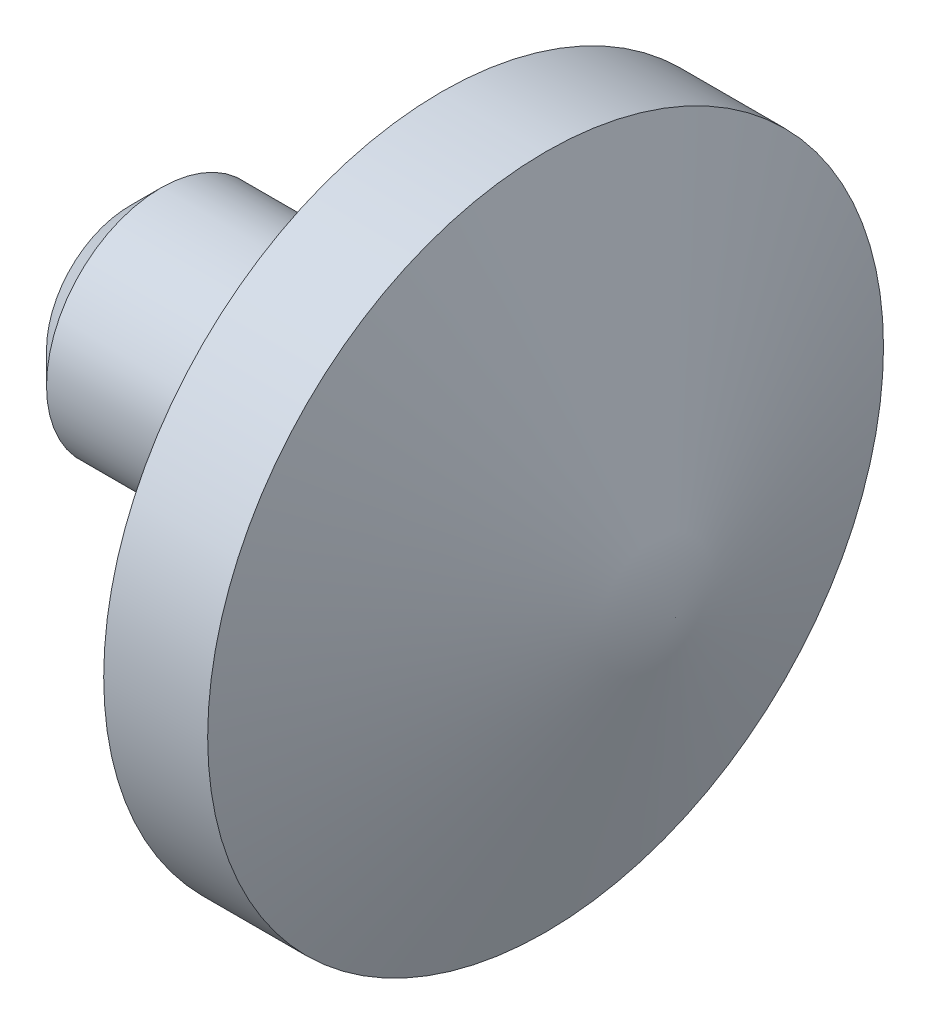
ISO-10303-21;
HEADER;
FILE_DESCRIPTION(('STEP AP214'),'2;1');
FILE_NAME('part.step','',(''),(''),'','','');
FILE_SCHEMA(('AUTOMOTIVE_DESIGN { 1 0 10303 214 1 1 1 1 }'));
ENDSEC;
DATA;
#1=APPLICATION_CONTEXT('core data for automotive mechanical design processes');
#2=APPLICATION_PROTOCOL_DEFINITION('international standard','automotive_design',2000,#1);
#3=PRODUCT_CONTEXT('',#1,'mechanical');
#4=PRODUCT('Part','Part','',(#3));
#5=PRODUCT_RELATED_PRODUCT_CATEGORY('part','',(#4));
#6=PRODUCT_DEFINITION_FORMATION('','',#4);
#7=PRODUCT_DEFINITION_CONTEXT('part definition',#1,'design');
#8=PRODUCT_DEFINITION('design','',#6,#7);
#9=PRODUCT_DEFINITION_SHAPE('','',#8);
#10=(LENGTH_UNIT() NAMED_UNIT(*) SI_UNIT(.MILLI.,.METRE.));
#11=(NAMED_UNIT(*) PLANE_ANGLE_UNIT() SI_UNIT($,.RADIAN.));
#12=(NAMED_UNIT(*) SI_UNIT($,.STERADIAN.) SOLID_ANGLE_UNIT());
#13=UNCERTAINTY_MEASURE_WITH_UNIT(LENGTH_MEASURE(1.E-05),#10,'distance_accuracy_value','');
#14=(GEOMETRIC_REPRESENTATION_CONTEXT(3) GLOBAL_UNCERTAINTY_ASSIGNED_CONTEXT((#13)) GLOBAL_UNIT_ASSIGNED_CONTEXT((#10,
#11,#12)) REPRESENTATION_CONTEXT('',''));
#15=CARTESIAN_POINT('',(0.,0.,0.));
#16=DIRECTION('',(0.,0.,1.));
#17=DIRECTION('',(1.,0.,0.));
#18=AXIS2_PLACEMENT_3D('',#15,#16,#17);
#19=CARTESIAN_POINT('',(2.25,0.,0.));
#20=DIRECTION('',(-1.,0.,0.));
#21=DIRECTION('',(0.,0.,1.));
#22=AXIS2_PLACEMENT_3D('',#19,#20,#21);
#23=CONICAL_SURFACE('',#22,0.,1.20362249297668);
#24=CARTESIAN_POINT('',(1.,0.,0.));
#25=DIRECTION('',(1.,0.,0.));
#26=DIRECTION('',(0.,0.,-1.));
#27=AXIS2_PLACEMENT_3D('',#24,#25,#26);
#28=CIRCLE('',#27,3.25);
#29=CARTESIAN_POINT('',(1.,0.,-3.25));
#30=VERTEX_POINT('',#29);
#31=EDGE_CURVE('E98',#30,#30,#28,.T.);
#32=ORIENTED_EDGE('',*,*,#31,.T.);
#33=EDGE_LOOP('',(#32));
#34=FACE_BOUND('',#33,.T.);
#35=CARTESIAN_POINT('',(2.25,0.,0.));
#36=VERTEX_POINT('',#35);
#37=VERTEX_LOOP('',#36);
#38=FACE_BOUND('',#37,.T.);
#39=ADVANCED_FACE('F55',(#34,#38),#23,.T.);
#40=CARTESIAN_POINT('',(-3.,0.,0.));
#41=DIRECTION('',(-1.,0.,0.));
#42=DIRECTION('',(0.,0.,1.));
#43=AXIS2_PLACEMENT_3D('',#40,#41,#42);
#44=PLANE('',#43);
#45=CARTESIAN_POINT('',(-3.,0.,0.));
#46=DIRECTION('',(-1.,0.,0.));
#47=DIRECTION('',(0.,0.,1.));
#48=AXIS2_PLACEMENT_3D('',#45,#46,#47);
#49=CIRCLE('',#48,0.799999999999999);
#50=CARTESIAN_POINT('',(-3.,0.,0.799999999999999));
#51=VERTEX_POINT('',#50);
#52=EDGE_CURVE('E11',#51,#51,#49,.T.);
#53=ORIENTED_EDGE('',*,*,#52,.T.);
#54=EDGE_LOOP('',(#53));
#55=FACE_BOUND('',#54,.T.);
#56=ADVANCED_FACE('F68',(#55),#44,.T.);
#57=CARTESIAN_POINT('',(0.,0.,0.));
#58=DIRECTION('',(1.,0.,0.));
#59=DIRECTION('',(0.,0.,-1.));
#60=AXIS2_PLACEMENT_3D('',#57,#58,#59);
#61=CYLINDRICAL_SURFACE('',#60,1.1);
#62=CARTESIAN_POINT('',(-2.7,0.,0.));
#63=DIRECTION('',(-1.,0.,0.));
#64=DIRECTION('',(0.,0.,1.));
#65=AXIS2_PLACEMENT_3D('',#62,#63,#64);
#66=CIRCLE('',#65,1.1);
#67=CARTESIAN_POINT('',(-2.7,0.,1.1));
#68=VERTEX_POINT('',#67);
#69=EDGE_CURVE('E64',#68,#68,#66,.F.);
#70=ORIENTED_EDGE('',*,*,#69,.T.);
#71=EDGE_LOOP('',(#70));
#72=FACE_BOUND('',#71,.T.);
#73=CARTESIAN_POINT('',(0.,0.,0.));
#74=DIRECTION('',(1.,0.,0.));
#75=DIRECTION('',(0.,0.,-1.));
#76=AXIS2_PLACEMENT_3D('',#73,#74,#75);
#77=CIRCLE('',#76,1.1);
#78=CARTESIAN_POINT('',(0.,0.,-1.1));
#79=VERTEX_POINT('',#78);
#80=EDGE_CURVE('E102',#79,#79,#77,.T.);
#81=ORIENTED_EDGE('',*,*,#80,.F.);
#82=EDGE_LOOP('',(#81));
#83=FACE_BOUND('',#82,.T.);
#84=ADVANCED_FACE('F74',(#72,#83),#61,.T.);
#85=CARTESIAN_POINT('',(0.,3.25,0.));
#86=DIRECTION('',(-1.,0.,0.));
#87=DIRECTION('',(0.,0.,1.));
#88=AXIS2_PLACEMENT_3D('',#85,#86,#87);
#89=PLANE('',#88);
#90=ORIENTED_EDGE('',*,*,#80,.T.);
#91=EDGE_LOOP('',(#90));
#92=FACE_BOUND('',#91,.T.);
#93=CARTESIAN_POINT('',(0.,0.,0.));
#94=DIRECTION('',(1.,0.,0.));
#95=DIRECTION('',(0.,0.,-1.));
#96=AXIS2_PLACEMENT_3D('',#93,#94,#95);
#97=CIRCLE('',#96,3.25);
#98=CARTESIAN_POINT('',(0.,0.,-3.25));
#99=VERTEX_POINT('',#98);
#100=EDGE_CURVE('E96',#99,#99,#97,.T.);
#101=ORIENTED_EDGE('',*,*,#100,.F.);
#102=EDGE_LOOP('',(#101));
#103=FACE_BOUND('',#102,.T.);
#104=ADVANCED_FACE('F81',(#92,#103),#89,.T.);
#105=CARTESIAN_POINT('',(0.,0.,0.));
#106=DIRECTION('',(1.,0.,0.));
#107=DIRECTION('',(0.,0.,-1.));
#108=AXIS2_PLACEMENT_3D('',#105,#106,#107);
#109=CYLINDRICAL_SURFACE('',#108,3.25);
#110=ORIENTED_EDGE('',*,*,#100,.T.);
#111=EDGE_LOOP('',(#110));
#112=FACE_BOUND('',#111,.T.);
#113=ORIENTED_EDGE('',*,*,#31,.F.);
#114=EDGE_LOOP('',(#113));
#115=FACE_BOUND('',#114,.T.);
#116=ADVANCED_FACE('F84',(#112,#115),#109,.T.);
#117=CARTESIAN_POINT('',(-2.7,0.,0.));
#118=DIRECTION('',(1.,0.,0.));
#119=DIRECTION('',(0.,0.,-1.));
#120=AXIS2_PLACEMENT_3D('',#117,#118,#119);
#121=CONICAL_SURFACE('',#120,1.1,0.785398163397449);
#122=ORIENTED_EDGE('',*,*,#52,.F.);
#123=EDGE_LOOP('',(#122));
#124=FACE_BOUND('',#123,.T.);
#125=ORIENTED_EDGE('',*,*,#69,.F.);
#126=EDGE_LOOP('',(#125));
#127=FACE_BOUND('',#126,.T.);
#128=ADVANCED_FACE('F58',(#124,#127),#121,.T.);
#129=CLOSED_SHELL('',(#39,#56,#84,#104,#116,#128));
#130=MANIFOLD_SOLID_BREP('B2',#129);
#131=ADVANCED_BREP_SHAPE_REPRESENTATION('',(#18,#130),#14);
#132=SHAPE_DEFINITION_REPRESENTATION(#9,#131);
ENDSEC;
END-ISO-10303-21;
